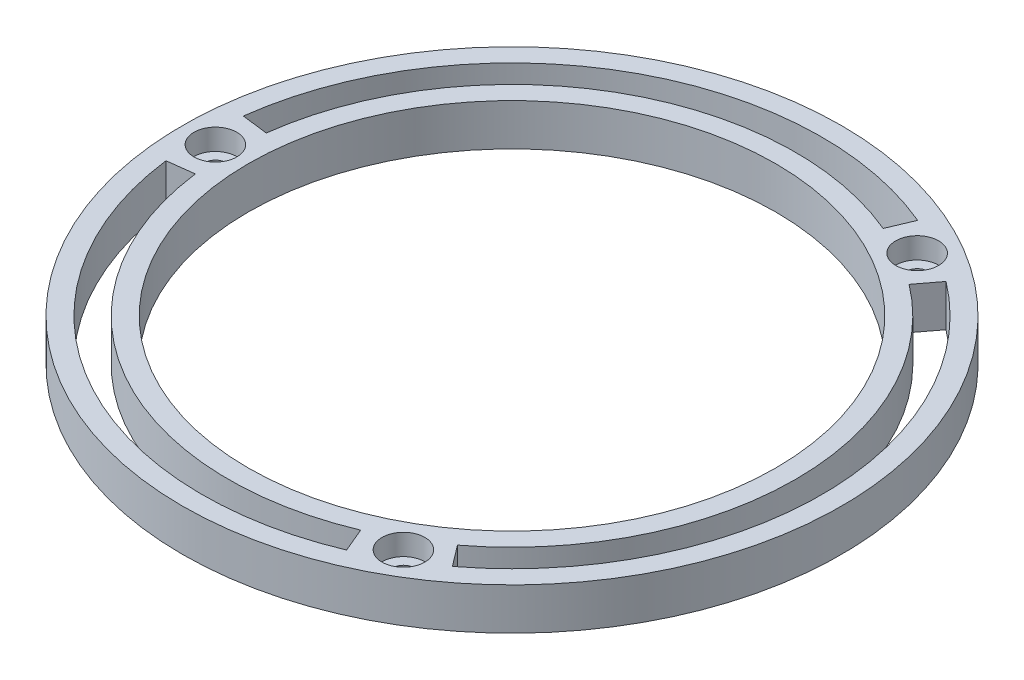
ISO-10303-21;
HEADER;
FILE_DESCRIPTION(('STEP AP214'),'2;1');
FILE_NAME('part.step','',(''),(''),'','','');
FILE_SCHEMA(('AUTOMOTIVE_DESIGN { 1 0 10303 214 1 1 1 1 }'));
ENDSEC;
DATA;
#1=APPLICATION_CONTEXT('core data for automotive mechanical design processes');
#2=APPLICATION_PROTOCOL_DEFINITION('international standard','automotive_design',2000,#1);
#3=PRODUCT_CONTEXT('',#1,'mechanical');
#4=PRODUCT('Part','Part','',(#3));
#5=PRODUCT_RELATED_PRODUCT_CATEGORY('part','',(#4));
#6=PRODUCT_DEFINITION_FORMATION('','',#4);
#7=PRODUCT_DEFINITION_CONTEXT('part definition',#1,'design');
#8=PRODUCT_DEFINITION('design','',#6,#7);
#9=PRODUCT_DEFINITION_SHAPE('','',#8);
#10=(LENGTH_UNIT() NAMED_UNIT(*) SI_UNIT(.MILLI.,.METRE.));
#11=(NAMED_UNIT(*) PLANE_ANGLE_UNIT() SI_UNIT($,.RADIAN.));
#12=(NAMED_UNIT(*) SI_UNIT($,.STERADIAN.) SOLID_ANGLE_UNIT());
#13=UNCERTAINTY_MEASURE_WITH_UNIT(LENGTH_MEASURE(1.E-05),#10,'distance_accuracy_value','');
#14=(GEOMETRIC_REPRESENTATION_CONTEXT(3) GLOBAL_UNCERTAINTY_ASSIGNED_CONTEXT((#13)) GLOBAL_UNIT_ASSIGNED_CONTEXT((#10,
#11,#12)) REPRESENTATION_CONTEXT('',''));
#15=CARTESIAN_POINT('',(0.,0.,0.));
#16=DIRECTION('',(0.,0.,1.));
#17=DIRECTION('',(1.,0.,0.));
#18=AXIS2_PLACEMENT_3D('',#15,#16,#17);
#19=CARTESIAN_POINT('',(22.5,-0.00100000000000013,-38.9711431702997));
#20=DIRECTION('',(0.,1.,0.));
#21=DIRECTION('',(0.,0.,1.));
#22=AXIS2_PLACEMENT_3D('',#19,#20,#21);
#23=CYLINDRICAL_SURFACE('',#22,1.65);
#24=CARTESIAN_POINT('',(22.5,0.,-38.9711431702997));
#25=DIRECTION('',(0.,1.,0.));
#26=DIRECTION('',(0.,0.,1.));
#27=AXIS2_PLACEMENT_3D('',#24,#25,#26);
#28=CIRCLE('',#27,1.65);
#29=CARTESIAN_POINT('',(22.5,0.,-37.3211431702997));
#30=VERTEX_POINT('',#29);
#31=EDGE_CURVE('E235',#30,#30,#28,.F.);
#32=ORIENTED_EDGE('',*,*,#31,.T.);
#33=EDGE_LOOP('',(#32));
#34=FACE_BOUND('',#33,.T.);
#35=CARTESIAN_POINT('',(22.5,3.15,-38.9711431702997));
#36=DIRECTION('',(0.,1.,0.));
#37=DIRECTION('',(0.,0.,1.));
#38=AXIS2_PLACEMENT_3D('',#35,#36,#37);
#39=CIRCLE('',#38,1.65);
#40=CARTESIAN_POINT('',(22.5,3.15,-37.3211431702997));
#41=VERTEX_POINT('',#40);
#42=EDGE_CURVE('E49',#41,#41,#39,.F.);
#43=ORIENTED_EDGE('',*,*,#42,.F.);
#44=EDGE_LOOP('',(#43));
#45=FACE_BOUND('',#44,.T.);
#46=ADVANCED_FACE('F45',(#34,#45),#23,.F.);
#47=CARTESIAN_POINT('',(22.5,-0.00100000000000013,38.9711431702997));
#48=DIRECTION('',(0.,1.,0.));
#49=DIRECTION('',(0.,0.,1.));
#50=AXIS2_PLACEMENT_3D('',#47,#48,#49);
#51=CYLINDRICAL_SURFACE('',#50,1.65);
#52=CARTESIAN_POINT('',(22.5,0.,38.9711431702997));
#53=DIRECTION('',(0.,1.,0.));
#54=DIRECTION('',(0.,0.,1.));
#55=AXIS2_PLACEMENT_3D('',#52,#53,#54);
#56=CIRCLE('',#55,1.65);
#57=CARTESIAN_POINT('',(22.5,0.,40.6211431702997));
#58=VERTEX_POINT('',#57);
#59=EDGE_CURVE('E239',#58,#58,#56,.F.);
#60=ORIENTED_EDGE('',*,*,#59,.T.);
#61=EDGE_LOOP('',(#60));
#62=FACE_BOUND('',#61,.T.);
#63=CARTESIAN_POINT('',(22.5,3.15,38.9711431702997));
#64=DIRECTION('',(0.,1.,0.));
#65=DIRECTION('',(0.,0.,1.));
#66=AXIS2_PLACEMENT_3D('',#63,#64,#65);
#67=CIRCLE('',#66,1.65);
#68=CARTESIAN_POINT('',(22.5,3.15,40.6211431702997));
#69=VERTEX_POINT('',#68);
#70=EDGE_CURVE('E229',#69,#69,#67,.F.);
#71=ORIENTED_EDGE('',*,*,#70,.F.);
#72=EDGE_LOOP('',(#71));
#73=FACE_BOUND('',#72,.T.);
#74=ADVANCED_FACE('F311',(#62,#73),#51,.F.);
#75=CARTESIAN_POINT('',(-45.,-0.00100000000000013,0.));
#76=DIRECTION('',(0.,1.,0.));
#77=DIRECTION('',(0.,0.,1.));
#78=AXIS2_PLACEMENT_3D('',#75,#76,#77);
#79=CYLINDRICAL_SURFACE('',#78,1.65);
#80=CARTESIAN_POINT('',(-45.,0.,0.));
#81=DIRECTION('',(0.,1.,0.));
#82=DIRECTION('',(0.,0.,1.));
#83=AXIS2_PLACEMENT_3D('',#80,#81,#82);
#84=CIRCLE('',#83,1.65);
#85=CARTESIAN_POINT('',(-45.,0.,1.65));
#86=VERTEX_POINT('',#85);
#87=EDGE_CURVE('E174',#86,#86,#84,.F.);
#88=ORIENTED_EDGE('',*,*,#87,.T.);
#89=EDGE_LOOP('',(#88));
#90=FACE_BOUND('',#89,.T.);
#91=CARTESIAN_POINT('',(-45.,3.15,0.));
#92=DIRECTION('',(0.,1.,0.));
#93=DIRECTION('',(0.,0.,1.));
#94=AXIS2_PLACEMENT_3D('',#91,#92,#93);
#95=CIRCLE('',#94,1.65);
#96=CARTESIAN_POINT('',(-45.,3.15,1.65));
#97=VERTEX_POINT('',#96);
#98=EDGE_CURVE('E227',#97,#97,#95,.F.);
#99=ORIENTED_EDGE('',*,*,#98,.F.);
#100=EDGE_LOOP('',(#99));
#101=FACE_BOUND('',#100,.T.);
#102=ADVANCED_FACE('F316',(#90,#101),#79,.F.);
#103=CARTESIAN_POINT('',(0.,6.35,0.));
#104=DIRECTION('',(-0.796732942804221,0.,0.604331546297664));
#105=DIRECTION('',(0.604331546297664,0.,0.796732942804221));
#106=AXIS2_PLACEMENT_3D('',#103,#104,#105);
#107=PLANE('',#106);
#108=DIRECTION('',(-0.604331546297664,0.,-0.796732942804221));
#109=VECTOR('',#108,1.);
#110=CARTESIAN_POINT('',(0.,0.,0.));
#111=LINE('',#110,#109);
#112=CARTESIAN_POINT('',(28.4035826759902,0.,37.4464483117984));
#113=VERTEX_POINT('',#112);
#114=CARTESIAN_POINT('',(25.9862564907996,0.,34.2595165405815));
#115=VERTEX_POINT('',#114);
#116=EDGE_CURVE('E197',#113,#115,#111,.T.);
#117=ORIENTED_EDGE('',*,*,#116,.T.);
#118=DIRECTION('',(0.,-1.,0.));
#119=VECTOR('',#118,1.);
#120=CARTESIAN_POINT('',(25.9862564907996,6.35,34.2595165405815));
#121=LINE('',#120,#119);
#122=CARTESIAN_POINT('',(25.9862564907996,6.35,34.2595165405815));
#123=VERTEX_POINT('',#122);
#124=EDGE_CURVE('E11',#123,#115,#121,.T.);
#125=ORIENTED_EDGE('',*,*,#124,.F.);
#126=DIRECTION('',(-0.604331546297664,0.,-0.796732942804221));
#127=VECTOR('',#126,1.);
#128=CARTESIAN_POINT('',(0.,6.35,0.));
#129=LINE('',#128,#127);
#130=CARTESIAN_POINT('',(28.4035826759902,6.35,37.4464483117984));
#131=VERTEX_POINT('',#130);
#132=EDGE_CURVE('E150',#131,#123,#129,.T.);
#133=ORIENTED_EDGE('',*,*,#132,.F.);
#134=DIRECTION('',(0.,-1.,0.));
#135=VECTOR('',#134,1.);
#136=CARTESIAN_POINT('',(28.4035826759902,6.35,37.4464483117984));
#137=LINE('',#136,#135);
#138=EDGE_CURVE('E64',#131,#113,#137,.T.);
#139=ORIENTED_EDGE('',*,*,#138,.T.);
#140=EDGE_LOOP('',(#117,#125,#133,#139));
#141=FACE_BOUND('',#140,.T.);
#142=ADVANCED_FACE('F323',(#141),#107,.F.);
#143=CARTESIAN_POINT('',(0.,6.35,0.));
#144=DIRECTION('',(0.,-1.,0.));
#145=DIRECTION('',(0.,0.,-1.));
#146=AXIS2_PLACEMENT_3D('',#143,#144,#145);
#147=CYLINDRICAL_SURFACE('',#146,43.);
#148=CARTESIAN_POINT('',(0.,0.,0.));
#149=DIRECTION('',(0.,1.,0.));
#150=DIRECTION('',(0.,0.,1.));
#151=AXIS2_PLACEMENT_3D('',#148,#149,#150);
#152=CIRCLE('',#151,43.);
#153=CARTESIAN_POINT('',(25.9862564907995,0.,-34.2595165405815));
#154=VERTEX_POINT('',#153);
#155=EDGE_CURVE('E156',#115,#154,#152,.T.);
#156=ORIENTED_EDGE('',*,*,#155,.T.);
#157=DIRECTION('',(0.,-1.,0.));
#158=VECTOR('',#157,1.);
#159=CARTESIAN_POINT('',(25.9862564907995,6.35,-34.2595165405815));
#160=LINE('',#159,#158);
#161=CARTESIAN_POINT('',(25.9862564907995,6.35,-34.2595165405815));
#162=VERTEX_POINT('',#161);
#163=EDGE_CURVE('E55',#162,#154,#160,.T.);
#164=ORIENTED_EDGE('',*,*,#163,.F.);
#165=CARTESIAN_POINT('',(0.,6.35,0.));
#166=DIRECTION('',(0.,1.,0.));
#167=DIRECTION('',(0.,0.,1.));
#168=AXIS2_PLACEMENT_3D('',#165,#166,#167);
#169=CIRCLE('',#168,43.);
#170=EDGE_CURVE('E143',#123,#162,#169,.T.);
#171=ORIENTED_EDGE('',*,*,#170,.F.);
#172=ORIENTED_EDGE('',*,*,#124,.T.);
#173=EDGE_LOOP('',(#156,#164,#171,#172));
#174=FACE_BOUND('',#173,.T.);
#175=ADVANCED_FACE('F155',(#174),#147,.T.);
#176=CARTESIAN_POINT('',(0.,6.35,0.));
#177=DIRECTION('',(0.796732942804222,0.,0.604331546297663));
#178=DIRECTION('',(0.604331546297663,0.,-0.796732942804222));
#179=AXIS2_PLACEMENT_3D('',#176,#177,#178);
#180=PLANE('',#179);
#181=DIRECTION('',(-0.604331546297663,0.,0.796732942804222));
#182=VECTOR('',#181,1.);
#183=CARTESIAN_POINT('',(0.,0.,0.));
#184=LINE('',#183,#182);
#185=CARTESIAN_POINT('',(28.4035826759902,0.,-37.4464483117984));
#186=VERTEX_POINT('',#185);
#187=EDGE_CURVE('E200',#186,#154,#184,.T.);
#188=ORIENTED_EDGE('',*,*,#187,.F.);
#189=DIRECTION('',(0.,-1.,0.));
#190=VECTOR('',#189,1.);
#191=CARTESIAN_POINT('',(28.4035826759902,6.35,-37.4464483117984));
#192=LINE('',#191,#190);
#193=CARTESIAN_POINT('',(28.4035826759902,6.35,-37.4464483117984));
#194=VERTEX_POINT('',#193);
#195=EDGE_CURVE('E102',#194,#186,#192,.T.);
#196=ORIENTED_EDGE('',*,*,#195,.F.);
#197=DIRECTION('',(-0.604331546297663,0.,0.796732942804222));
#198=VECTOR('',#197,1.);
#199=CARTESIAN_POINT('',(0.,6.35,0.));
#200=LINE('',#199,#198);
#201=EDGE_CURVE('E149',#194,#162,#200,.T.);
#202=ORIENTED_EDGE('',*,*,#201,.T.);
#203=ORIENTED_EDGE('',*,*,#163,.T.);
#204=EDGE_LOOP('',(#188,#196,#202,#203));
#205=FACE_BOUND('',#204,.T.);
#206=ADVANCED_FACE('F160',(#205),#180,.T.);
#207=CARTESIAN_POINT('',(0.,6.35,0.));
#208=DIRECTION('',(0.,-1.,0.));
#209=DIRECTION('',(0.,0.,-1.));
#210=AXIS2_PLACEMENT_3D('',#207,#208,#209);
#211=CYLINDRICAL_SURFACE('',#210,43.);
#212=CARTESIAN_POINT('',(0.,0.,0.));
#213=DIRECTION('',(0.,1.,0.));
#214=DIRECTION('',(0.,0.,1.));
#215=AXIS2_PLACEMENT_3D('',#212,#213,#214);
#216=CIRCLE('',#215,43.);
#217=CARTESIAN_POINT('',(16.6764834001168,0.,-39.6345165405815));
#218=VERTEX_POINT('',#217);
#219=CARTESIAN_POINT('',(-42.6627398909165,0.,-5.375));
#220=VERTEX_POINT('',#219);
#221=EDGE_CURVE('E186',#218,#220,#216,.T.);
#222=ORIENTED_EDGE('',*,*,#221,.T.);
#223=DIRECTION('',(0.,-1.,0.));
#224=VECTOR('',#223,1.);
#225=CARTESIAN_POINT('',(-42.6627398909165,6.35,-5.375));
#226=LINE('',#225,#224);
#227=CARTESIAN_POINT('',(-42.6627398909165,6.35,-5.375));
#228=VERTEX_POINT('',#227);
#229=EDGE_CURVE('E210',#228,#220,#226,.T.);
#230=ORIENTED_EDGE('',*,*,#229,.F.);
#231=CARTESIAN_POINT('',(0.,6.35,0.));
#232=DIRECTION('',(0.,1.,0.));
#233=DIRECTION('',(0.,0.,1.));
#234=AXIS2_PLACEMENT_3D('',#231,#232,#233);
#235=CIRCLE('',#234,43.);
#236=CARTESIAN_POINT('',(16.6764834001168,6.35,-39.6345165405815));
#237=VERTEX_POINT('',#236);
#238=EDGE_CURVE('E258',#237,#228,#235,.T.);
#239=ORIENTED_EDGE('',*,*,#238,.F.);
#240=DIRECTION('',(0.,-1.,0.));
#241=VECTOR('',#240,1.);
#242=CARTESIAN_POINT('',(16.6764834001168,6.35,-39.6345165405815));
#243=LINE('',#242,#241);
#244=EDGE_CURVE('E212',#237,#218,#243,.T.);
#245=ORIENTED_EDGE('',*,*,#244,.T.);
#246=EDGE_LOOP('',(#222,#230,#239,#245));
#247=FACE_BOUND('',#246,.T.);
#248=ADVANCED_FACE('F279',(#247),#211,.T.);
#249=CARTESIAN_POINT('',(0.,6.35,0.));
#250=DIRECTION('',(0.125,0.,-0.992156741649221));
#251=DIRECTION('',(-0.992156741649222,0.,-0.125));
#252=AXIS2_PLACEMENT_3D('',#249,#250,#251);
#253=PLANE('',#252);
#254=DIRECTION('',(0.992156741649222,0.,0.125));
#255=VECTOR('',#254,1.);
#256=CARTESIAN_POINT('',(0.,0.,0.));
#257=LINE('',#256,#255);
#258=CARTESIAN_POINT('',(-46.6313668575134,0.,-5.875));
#259=VERTEX_POINT('',#258);
#260=EDGE_CURVE('E189',#259,#220,#257,.T.);
#261=ORIENTED_EDGE('',*,*,#260,.F.);
#262=DIRECTION('',(0.,-1.,0.));
#263=VECTOR('',#262,1.);
#264=CARTESIAN_POINT('',(-46.6313668575134,6.35,-5.875));
#265=LINE('',#264,#263);
#266=CARTESIAN_POINT('',(-46.6313668575134,6.35,-5.875));
#267=VERTEX_POINT('',#266);
#268=EDGE_CURVE('E218',#267,#259,#265,.T.);
#269=ORIENTED_EDGE('',*,*,#268,.F.);
#270=DIRECTION('',(0.992156741649222,0.,0.125));
#271=VECTOR('',#270,1.);
#272=CARTESIAN_POINT('',(0.,6.35,0.));
#273=LINE('',#272,#271);
#274=EDGE_CURVE('E260',#267,#228,#273,.T.);
#275=ORIENTED_EDGE('',*,*,#274,.T.);
#276=ORIENTED_EDGE('',*,*,#229,.T.);
#277=EDGE_LOOP('',(#261,#269,#275,#276));
#278=FACE_BOUND('',#277,.T.);
#279=ADVANCED_FACE('F282',(#278),#253,.T.);
#280=CARTESIAN_POINT('',(0.,6.35,0.));
#281=DIRECTION('',(0.,-1.,0.));
#282=DIRECTION('',(0.,0.,-1.));
#283=AXIS2_PLACEMENT_3D('',#280,#281,#282);
#284=CYLINDRICAL_SURFACE('',#283,47.);
#285=CARTESIAN_POINT('',(0.,0.,0.));
#286=DIRECTION('',(0.,1.,0.));
#287=DIRECTION('',(0.,0.,1.));
#288=AXIS2_PLACEMENT_3D('',#285,#286,#287);
#289=CIRCLE('',#288,47.);
#290=CARTESIAN_POINT('',(18.227784181523,0.,-43.3214483117984));
#291=VERTEX_POINT('',#290);
#292=EDGE_CURVE('E192',#291,#259,#289,.T.);
#293=ORIENTED_EDGE('',*,*,#292,.F.);
#294=DIRECTION('',(0.,-1.,0.));
#295=VECTOR('',#294,1.);
#296=CARTESIAN_POINT('',(18.227784181523,6.35,-43.3214483117984));
#297=LINE('',#296,#295);
#298=CARTESIAN_POINT('',(18.227784181523,6.35,-43.3214483117984));
#299=VERTEX_POINT('',#298);
#300=EDGE_CURVE('E215',#299,#291,#297,.T.);
#301=ORIENTED_EDGE('',*,*,#300,.F.);
#302=CARTESIAN_POINT('',(0.,6.35,0.));
#303=DIRECTION('',(0.,1.,0.));
#304=DIRECTION('',(0.,0.,1.));
#305=AXIS2_PLACEMENT_3D('',#302,#303,#304);
#306=CIRCLE('',#305,47.);
#307=EDGE_CURVE('E263',#299,#267,#306,.T.);
#308=ORIENTED_EDGE('',*,*,#307,.T.);
#309=ORIENTED_EDGE('',*,*,#268,.T.);
#310=EDGE_LOOP('',(#293,#301,#308,#309));
#311=FACE_BOUND('',#310,.T.);
#312=ADVANCED_FACE('F285',(#311),#284,.F.);
#313=CARTESIAN_POINT('',(0.,6.35,0.));
#314=DIRECTION('',(-0.125,0.,-0.992156741649221));
#315=DIRECTION('',(-0.992156741649222,0.,0.125));
#316=AXIS2_PLACEMENT_3D('',#313,#314,#315);
#317=PLANE('',#316);
#318=DIRECTION('',(0.992156741649222,0.,-0.125));
#319=VECTOR('',#318,1.);
#320=CARTESIAN_POINT('',(0.,0.,0.));
#321=LINE('',#320,#319);
#322=CARTESIAN_POINT('',(-46.6313668575134,0.,5.875));
#323=VERTEX_POINT('',#322);
#324=CARTESIAN_POINT('',(-42.6627398909165,0.,5.375));
#325=VERTEX_POINT('',#324);
#326=EDGE_CURVE('E173',#323,#325,#321,.T.);
#327=ORIENTED_EDGE('',*,*,#326,.T.);
#328=DIRECTION('',(0.,-1.,0.));
#329=VECTOR('',#328,1.);
#330=CARTESIAN_POINT('',(-42.6627398909165,6.35,5.375));
#331=LINE('',#330,#329);
#332=CARTESIAN_POINT('',(-42.6627398909165,6.35,5.375));
#333=VERTEX_POINT('',#332);
#334=EDGE_CURVE('E216',#333,#325,#331,.T.);
#335=ORIENTED_EDGE('',*,*,#334,.F.);
#336=DIRECTION('',(0.992156741649222,0.,-0.125));
#337=VECTOR('',#336,1.);
#338=CARTESIAN_POINT('',(0.,6.35,0.));
#339=LINE('',#338,#337);
#340=CARTESIAN_POINT('',(-46.6313668575134,6.35,5.875));
#341=VERTEX_POINT('',#340);
#342=EDGE_CURVE('E249',#341,#333,#339,.T.);
#343=ORIENTED_EDGE('',*,*,#342,.F.);
#344=DIRECTION('',(0.,-1.,0.));
#345=VECTOR('',#344,1.);
#346=CARTESIAN_POINT('',(-46.6313668575134,6.35,5.875));
#347=LINE('',#346,#345);
#348=EDGE_CURVE('E169',#341,#323,#347,.T.);
#349=ORIENTED_EDGE('',*,*,#348,.T.);
#350=EDGE_LOOP('',(#327,#335,#343,#349));
#351=FACE_BOUND('',#350,.T.);
#352=ADVANCED_FACE('F390',(#351),#317,.F.);
#353=CARTESIAN_POINT('',(0.,6.35,0.));
#354=DIRECTION('',(0.,-1.,0.));
#355=DIRECTION('',(0.,0.,-1.));
#356=AXIS2_PLACEMENT_3D('',#353,#354,#355);
#357=CYLINDRICAL_SURFACE('',#356,43.);
#358=CARTESIAN_POINT('',(0.,0.,0.));
#359=DIRECTION('',(0.,1.,0.));
#360=DIRECTION('',(0.,0.,1.));
#361=AXIS2_PLACEMENT_3D('',#358,#359,#360);
#362=CIRCLE('',#361,43.);
#363=CARTESIAN_POINT('',(16.6764834001168,0.,39.6345165405815));
#364=VERTEX_POINT('',#363);
#365=EDGE_CURVE('E177',#325,#364,#362,.T.);
#366=ORIENTED_EDGE('',*,*,#365,.T.);
#367=DIRECTION('',(0.,-1.,0.));
#368=VECTOR('',#367,1.);
#369=CARTESIAN_POINT('',(16.6764834001168,6.35,39.6345165405815));
#370=LINE('',#369,#368);
#371=CARTESIAN_POINT('',(16.6764834001168,6.35,39.6345165405815));
#372=VERTEX_POINT('',#371);
#373=EDGE_CURVE('E224',#372,#364,#370,.T.);
#374=ORIENTED_EDGE('',*,*,#373,.F.);
#375=CARTESIAN_POINT('',(0.,6.35,0.));
#376=DIRECTION('',(0.,1.,0.));
#377=DIRECTION('',(0.,0.,1.));
#378=AXIS2_PLACEMENT_3D('',#375,#376,#377);
#379=CIRCLE('',#378,43.);
#380=EDGE_CURVE('E115',#333,#372,#379,.T.);
#381=ORIENTED_EDGE('',*,*,#380,.F.);
#382=ORIENTED_EDGE('',*,*,#334,.T.);
#383=EDGE_LOOP('',(#366,#374,#381,#382));
#384=FACE_BOUND('',#383,.T.);
#385=ADVANCED_FACE('F389',(#384),#357,.T.);
#386=CARTESIAN_POINT('',(0.,6.35,0.));
#387=DIRECTION('',(-0.921732942804221,0.,0.387825195351554));
#388=DIRECTION('',(0.387825195351554,0.,0.921732942804221));
#389=AXIS2_PLACEMENT_3D('',#386,#387,#388);
#390=PLANE('',#389);
#391=DIRECTION('',(-0.387825195351554,0.,-0.921732942804221));
#392=VECTOR('',#391,1.);
#393=CARTESIAN_POINT('',(0.,0.,0.));
#394=LINE('',#393,#392);
#395=CARTESIAN_POINT('',(18.227784181523,0.,43.3214483117984));
#396=VERTEX_POINT('',#395);
#397=EDGE_CURVE('E180',#396,#364,#394,.T.);
#398=ORIENTED_EDGE('',*,*,#397,.F.);
#399=DIRECTION('',(0.,-1.,0.));
#400=VECTOR('',#399,1.);
#401=CARTESIAN_POINT('',(18.227784181523,6.35,43.3214483117984));
#402=LINE('',#401,#400);
#403=CARTESIAN_POINT('',(18.227784181523,6.35,43.3214483117984));
#404=VERTEX_POINT('',#403);
#405=EDGE_CURVE('E222',#404,#396,#402,.T.);
#406=ORIENTED_EDGE('',*,*,#405,.F.);
#407=DIRECTION('',(-0.387825195351554,0.,-0.921732942804221));
#408=VECTOR('',#407,1.);
#409=CARTESIAN_POINT('',(0.,6.35,0.));
#410=LINE('',#409,#408);
#411=EDGE_CURVE('E252',#404,#372,#410,.T.);
#412=ORIENTED_EDGE('',*,*,#411,.T.);
#413=ORIENTED_EDGE('',*,*,#373,.T.);
#414=EDGE_LOOP('',(#398,#406,#412,#413));
#415=FACE_BOUND('',#414,.T.);
#416=ADVANCED_FACE('F388',(#415),#390,.T.);
#417=CARTESIAN_POINT('',(0.,6.35,0.));
#418=DIRECTION('',(0.,-1.,0.));
#419=DIRECTION('',(0.,0.,-1.));
#420=AXIS2_PLACEMENT_3D('',#417,#418,#419);
#421=CYLINDRICAL_SURFACE('',#420,47.);
#422=CARTESIAN_POINT('',(0.,0.,0.));
#423=DIRECTION('',(0.,1.,0.));
#424=DIRECTION('',(0.,0.,1.));
#425=AXIS2_PLACEMENT_3D('',#422,#423,#424);
#426=CIRCLE('',#425,47.);
#427=EDGE_CURVE('E202',#113,#186,#426,.T.);
#428=ORIENTED_EDGE('',*,*,#427,.F.);
#429=ORIENTED_EDGE('',*,*,#138,.F.);
#430=CARTESIAN_POINT('',(0.,6.35,0.));
#431=DIRECTION('',(0.,1.,0.));
#432=DIRECTION('',(0.,0.,1.));
#433=AXIS2_PLACEMENT_3D('',#430,#431,#432);
#434=CIRCLE('',#433,47.);
#435=EDGE_CURVE('E161',#131,#194,#434,.T.);
#436=ORIENTED_EDGE('',*,*,#435,.T.);
#437=ORIENTED_EDGE('',*,*,#195,.T.);
#438=EDGE_LOOP('',(#428,#429,#436,#437));
#439=FACE_BOUND('',#438,.T.);
#440=ADVANCED_FACE('F402',(#439),#421,.F.);
#441=CARTESIAN_POINT('',(0.,6.35,0.));
#442=DIRECTION('',(0.921732942804221,0.,0.387825195351553));
#443=DIRECTION('',(0.387825195351553,0.,-0.921732942804221));
#444=AXIS2_PLACEMENT_3D('',#441,#442,#443);
#445=PLANE('',#444);
#446=DIRECTION('',(-0.387825195351553,0.,0.921732942804221));
#447=VECTOR('',#446,1.);
#448=CARTESIAN_POINT('',(0.,0.,0.));
#449=LINE('',#448,#447);
#450=EDGE_CURVE('E195',#291,#218,#449,.T.);
#451=ORIENTED_EDGE('',*,*,#450,.T.);
#452=ORIENTED_EDGE('',*,*,#244,.F.);
#453=DIRECTION('',(-0.387825195351553,0.,0.921732942804221));
#454=VECTOR('',#453,1.);
#455=CARTESIAN_POINT('',(0.,6.35,0.));
#456=LINE('',#455,#454);
#457=EDGE_CURVE('E266',#299,#237,#456,.T.);
#458=ORIENTED_EDGE('',*,*,#457,.F.);
#459=ORIENTED_EDGE('',*,*,#300,.T.);
#460=EDGE_LOOP('',(#451,#452,#458,#459));
#461=FACE_BOUND('',#460,.T.);
#462=ADVANCED_FACE('F275',(#461),#445,.F.);
#463=CARTESIAN_POINT('',(0.,6.35,0.));
#464=DIRECTION('',(0.,-1.,0.));
#465=DIRECTION('',(0.,0.,-1.));
#466=AXIS2_PLACEMENT_3D('',#463,#464,#465);
#467=CYLINDRICAL_SURFACE('',#466,47.);
#468=CARTESIAN_POINT('',(0.,0.,0.));
#469=DIRECTION('',(0.,1.,0.));
#470=DIRECTION('',(0.,0.,1.));
#471=AXIS2_PLACEMENT_3D('',#468,#469,#470);
#472=CIRCLE('',#471,47.);
#473=EDGE_CURVE('E183',#323,#396,#472,.T.);
#474=ORIENTED_EDGE('',*,*,#473,.F.);
#475=ORIENTED_EDGE('',*,*,#348,.F.);
#476=CARTESIAN_POINT('',(0.,6.35,0.));
#477=DIRECTION('',(0.,1.,0.));
#478=DIRECTION('',(0.,0.,1.));
#479=AXIS2_PLACEMENT_3D('',#476,#477,#478);
#480=CIRCLE('',#479,47.);
#481=EDGE_CURVE('E255',#341,#404,#480,.T.);
#482=ORIENTED_EDGE('',*,*,#481,.T.);
#483=ORIENTED_EDGE('',*,*,#405,.T.);
#484=EDGE_LOOP('',(#474,#475,#482,#483));
#485=FACE_BOUND('',#484,.T.);
#486=ADVANCED_FACE('F306',(#485),#467,.F.);
#487=CARTESIAN_POINT('',(0.,6.35,0.));
#488=DIRECTION('',(0.,-1.,0.));
#489=DIRECTION('',(0.,0.,-1.));
#490=AXIS2_PLACEMENT_3D('',#487,#488,#489);
#491=CYLINDRICAL_SURFACE('',#490,40.);
#492=CARTESIAN_POINT('',(0.,6.35,0.));
#493=DIRECTION('',(0.,1.,0.));
#494=DIRECTION('',(0.,0.,1.));
#495=AXIS2_PLACEMENT_3D('',#492,#493,#494);
#496=CIRCLE('',#495,40.);
#497=CARTESIAN_POINT('',(0.,6.35,40.));
#498=VERTEX_POINT('',#497);
#499=EDGE_CURVE('E208',#498,#498,#496,.T.);
#500=ORIENTED_EDGE('',*,*,#499,.T.);
#501=EDGE_LOOP('',(#500));
#502=FACE_BOUND('',#501,.T.);
#503=CARTESIAN_POINT('',(0.,0.,0.));
#504=DIRECTION('',(0.,1.,0.));
#505=DIRECTION('',(0.,0.,1.));
#506=AXIS2_PLACEMENT_3D('',#503,#504,#505);
#507=CIRCLE('',#506,40.);
#508=CARTESIAN_POINT('',(0.,0.,40.));
#509=VERTEX_POINT('',#508);
#510=EDGE_CURVE('E170',#509,#509,#507,.T.);
#511=ORIENTED_EDGE('',*,*,#510,.F.);
#512=EDGE_LOOP('',(#511));
#513=FACE_BOUND('',#512,.T.);
#514=ADVANCED_FACE('F47',(#502,#513),#491,.F.);
#515=CARTESIAN_POINT('',(0.,6.35,0.));
#516=DIRECTION('',(0.,-1.,0.));
#517=DIRECTION('',(0.,0.,-1.));
#518=AXIS2_PLACEMENT_3D('',#515,#516,#517);
#519=CYLINDRICAL_SURFACE('',#518,50.);
#520=CARTESIAN_POINT('',(0.,6.35,0.));
#521=DIRECTION('',(0.,1.,0.));
#522=DIRECTION('',(0.,0.,1.));
#523=AXIS2_PLACEMENT_3D('',#520,#521,#522);
#524=CIRCLE('',#523,50.);
#525=CARTESIAN_POINT('',(0.,6.35,50.));
#526=VERTEX_POINT('',#525);
#527=EDGE_CURVE('E163',#526,#526,#524,.T.);
#528=ORIENTED_EDGE('',*,*,#527,.F.);
#529=EDGE_LOOP('',(#528));
#530=FACE_BOUND('',#529,.T.);
#531=CARTESIAN_POINT('',(0.,0.,0.));
#532=DIRECTION('',(0.,1.,0.));
#533=DIRECTION('',(0.,0.,1.));
#534=AXIS2_PLACEMENT_3D('',#531,#532,#533);
#535=CIRCLE('',#534,50.);
#536=CARTESIAN_POINT('',(0.,0.,50.));
#537=VERTEX_POINT('',#536);
#538=EDGE_CURVE('E205',#537,#537,#535,.T.);
#539=ORIENTED_EDGE('',*,*,#538,.T.);
#540=EDGE_LOOP('',(#539));
#541=FACE_BOUND('',#540,.T.);
#542=ADVANCED_FACE('F296',(#530,#541),#519,.T.);
#543=CARTESIAN_POINT('',(0.,6.35,0.));
#544=DIRECTION('',(0.,1.,0.));
#545=DIRECTION('',(0.,0.,1.));
#546=AXIS2_PLACEMENT_3D('',#543,#544,#545);
#547=PLANE('',#546);
#548=CARTESIAN_POINT('',(-45.,6.35,0.));
#549=DIRECTION('',(0.,1.,0.));
#550=DIRECTION('',(0.,0.,1.));
#551=AXIS2_PLACEMENT_3D('',#548,#549,#550);
#552=CIRCLE('',#551,3.25);
#553=CARTESIAN_POINT('',(-45.,6.35,3.25));
#554=VERTEX_POINT('',#553);
#555=EDGE_CURVE('E354',#554,#554,#552,.T.);
#556=ORIENTED_EDGE('',*,*,#555,.F.);
#557=EDGE_LOOP('',(#556));
#558=FACE_BOUND('',#557,.T.);
#559=CARTESIAN_POINT('',(22.5,6.35,-38.9711431702997));
#560=DIRECTION('',(0.,1.,0.));
#561=DIRECTION('',(0.,0.,1.));
#562=AXIS2_PLACEMENT_3D('',#559,#560,#561);
#563=CIRCLE('',#562,3.25);
#564=CARTESIAN_POINT('',(22.5,6.35,-35.7211431702997));
#565=VERTEX_POINT('',#564);
#566=EDGE_CURVE('E357',#565,#565,#563,.T.);
#567=ORIENTED_EDGE('',*,*,#566,.F.);
#568=EDGE_LOOP('',(#567));
#569=FACE_BOUND('',#568,.T.);
#570=CARTESIAN_POINT('',(22.5,6.35,38.9711431702997));
#571=DIRECTION('',(0.,1.,0.));
#572=DIRECTION('',(0.,0.,1.));
#573=AXIS2_PLACEMENT_3D('',#570,#571,#572);
#574=CIRCLE('',#573,3.25);
#575=CARTESIAN_POINT('',(22.5,6.35,42.2211431702997));
#576=VERTEX_POINT('',#575);
#577=EDGE_CURVE('E365',#576,#576,#574,.T.);
#578=ORIENTED_EDGE('',*,*,#577,.F.);
#579=EDGE_LOOP('',(#578));
#580=FACE_BOUND('',#579,.T.);
#581=ORIENTED_EDGE('',*,*,#499,.F.);
#582=EDGE_LOOP('',(#581));
#583=FACE_BOUND('',#582,.T.);
#584=ORIENTED_EDGE('',*,*,#342,.T.);
#585=ORIENTED_EDGE('',*,*,#380,.T.);
#586=ORIENTED_EDGE('',*,*,#411,.F.);
#587=ORIENTED_EDGE('',*,*,#481,.F.);
#588=EDGE_LOOP('',(#584,#585,#586,#587));
#589=FACE_BOUND('',#588,.T.);
#590=ORIENTED_EDGE('',*,*,#238,.T.);
#591=ORIENTED_EDGE('',*,*,#274,.F.);
#592=ORIENTED_EDGE('',*,*,#307,.F.);
#593=ORIENTED_EDGE('',*,*,#457,.T.);
#594=EDGE_LOOP('',(#590,#591,#592,#593));
#595=FACE_BOUND('',#594,.T.);
#596=ORIENTED_EDGE('',*,*,#132,.T.);
#597=ORIENTED_EDGE('',*,*,#170,.T.);
#598=ORIENTED_EDGE('',*,*,#201,.F.);
#599=ORIENTED_EDGE('',*,*,#435,.F.);
#600=EDGE_LOOP('',(#596,#597,#598,#599));
#601=FACE_BOUND('',#600,.T.);
#602=ORIENTED_EDGE('',*,*,#527,.T.);
#603=EDGE_LOOP('',(#602));
#604=FACE_BOUND('',#603,.T.);
#605=ADVANCED_FACE('F145',(#558,#569,#580,#583,#589,#595,#601,#604),#547,.T.);
#606=CARTESIAN_POINT('',(0.,0.,0.));
#607=DIRECTION('',(0.,1.,0.));
#608=DIRECTION('',(0.,0.,1.));
#609=AXIS2_PLACEMENT_3D('',#606,#607,#608);
#610=PLANE('',#609);
#611=ORIENTED_EDGE('',*,*,#87,.F.);
#612=EDGE_LOOP('',(#611));
#613=FACE_BOUND('',#612,.T.);
#614=ORIENTED_EDGE('',*,*,#59,.F.);
#615=EDGE_LOOP('',(#614));
#616=FACE_BOUND('',#615,.T.);
#617=ORIENTED_EDGE('',*,*,#31,.F.);
#618=EDGE_LOOP('',(#617));
#619=FACE_BOUND('',#618,.T.);
#620=ORIENTED_EDGE('',*,*,#510,.T.);
#621=EDGE_LOOP('',(#620));
#622=FACE_BOUND('',#621,.T.);
#623=ORIENTED_EDGE('',*,*,#326,.F.);
#624=ORIENTED_EDGE('',*,*,#473,.T.);
#625=ORIENTED_EDGE('',*,*,#397,.T.);
#626=ORIENTED_EDGE('',*,*,#365,.F.);
#627=EDGE_LOOP('',(#623,#624,#625,#626));
#628=FACE_BOUND('',#627,.T.);
#629=ORIENTED_EDGE('',*,*,#221,.F.);
#630=ORIENTED_EDGE('',*,*,#450,.F.);
#631=ORIENTED_EDGE('',*,*,#292,.T.);
#632=ORIENTED_EDGE('',*,*,#260,.T.);
#633=EDGE_LOOP('',(#629,#630,#631,#632));
#634=FACE_BOUND('',#633,.T.);
#635=ORIENTED_EDGE('',*,*,#116,.F.);
#636=ORIENTED_EDGE('',*,*,#427,.T.);
#637=ORIENTED_EDGE('',*,*,#187,.T.);
#638=ORIENTED_EDGE('',*,*,#155,.F.);
#639=EDGE_LOOP('',(#635,#636,#637,#638));
#640=FACE_BOUND('',#639,.T.);
#641=ORIENTED_EDGE('',*,*,#538,.F.);
#642=EDGE_LOOP('',(#641));
#643=FACE_BOUND('',#642,.T.);
#644=ADVANCED_FACE('F287',(#613,#616,#619,#622,#628,#634,#640,#643),#610,.F.);
#645=CARTESIAN_POINT('',(-45.,3.15,0.));
#646=DIRECTION('',(0.,1.,0.));
#647=DIRECTION('',(0.,0.,1.));
#648=AXIS2_PLACEMENT_3D('',#645,#646,#647);
#649=PLANE('',#648);
#650=CARTESIAN_POINT('',(-45.,3.15,0.));
#651=DIRECTION('',(0.,1.,0.));
#652=DIRECTION('',(0.,0.,1.));
#653=AXIS2_PLACEMENT_3D('',#650,#651,#652);
#654=CIRCLE('',#653,3.25);
#655=CARTESIAN_POINT('',(-45.,3.15,3.25));
#656=VERTEX_POINT('',#655);
#657=EDGE_CURVE('E230',#656,#656,#654,.T.);
#658=ORIENTED_EDGE('',*,*,#657,.T.);
#659=EDGE_LOOP('',(#658));
#660=FACE_BOUND('',#659,.T.);
#661=ORIENTED_EDGE('',*,*,#98,.T.);
#662=EDGE_LOOP('',(#661));
#663=FACE_BOUND('',#662,.T.);
#664=ADVANCED_FACE('F290',(#660,#663),#649,.T.);
#665=CARTESIAN_POINT('',(-45.,3.15,0.));
#666=DIRECTION('',(0.,1.,0.));
#667=DIRECTION('',(0.,0.,1.));
#668=AXIS2_PLACEMENT_3D('',#665,#666,#667);
#669=CYLINDRICAL_SURFACE('',#668,3.25);
#670=ORIENTED_EDGE('',*,*,#657,.F.);
#671=EDGE_LOOP('',(#670));
#672=FACE_BOUND('',#671,.T.);
#673=ORIENTED_EDGE('',*,*,#555,.T.);
#674=EDGE_LOOP('',(#673));
#675=FACE_BOUND('',#674,.T.);
#676=ADVANCED_FACE('F329',(#672,#675),#669,.F.);
#677=CARTESIAN_POINT('',(22.5,3.15,38.9711431702997));
#678=DIRECTION('',(0.,1.,0.));
#679=DIRECTION('',(0.,0.,1.));
#680=AXIS2_PLACEMENT_3D('',#677,#678,#679);
#681=PLANE('',#680);
#682=CARTESIAN_POINT('',(22.5,3.15,38.9711431702997));
#683=DIRECTION('',(0.,1.,0.));
#684=DIRECTION('',(0.,0.,1.));
#685=AXIS2_PLACEMENT_3D('',#682,#683,#684);
#686=CIRCLE('',#685,3.25);
#687=CARTESIAN_POINT('',(22.5,3.15,42.2211431702997));
#688=VERTEX_POINT('',#687);
#689=EDGE_CURVE('E368',#688,#688,#686,.T.);
#690=ORIENTED_EDGE('',*,*,#689,.T.);
#691=EDGE_LOOP('',(#690));
#692=FACE_BOUND('',#691,.T.);
#693=ORIENTED_EDGE('',*,*,#70,.T.);
#694=EDGE_LOOP('',(#693));
#695=FACE_BOUND('',#694,.T.);
#696=ADVANCED_FACE('F325',(#692,#695),#681,.T.);
#697=CARTESIAN_POINT('',(22.5,3.15,38.9711431702997));
#698=DIRECTION('',(0.,1.,0.));
#699=DIRECTION('',(0.,0.,1.));
#700=AXIS2_PLACEMENT_3D('',#697,#698,#699);
#701=CYLINDRICAL_SURFACE('',#700,3.25);
#702=ORIENTED_EDGE('',*,*,#689,.F.);
#703=EDGE_LOOP('',(#702));
#704=FACE_BOUND('',#703,.T.);
#705=ORIENTED_EDGE('',*,*,#577,.T.);
#706=EDGE_LOOP('',(#705));
#707=FACE_BOUND('',#706,.T.);
#708=ADVANCED_FACE('F328',(#704,#707),#701,.F.);
#709=CARTESIAN_POINT('',(22.5,3.15,-38.9711431702997));
#710=DIRECTION('',(0.,1.,0.));
#711=DIRECTION('',(0.,0.,1.));
#712=AXIS2_PLACEMENT_3D('',#709,#710,#711);
#713=PLANE('',#712);
#714=CARTESIAN_POINT('',(22.5,3.15,-38.9711431702997));
#715=DIRECTION('',(0.,1.,0.));
#716=DIRECTION('',(0.,0.,1.));
#717=AXIS2_PLACEMENT_3D('',#714,#715,#716);
#718=CIRCLE('',#717,3.25);
#719=CARTESIAN_POINT('',(22.5,3.15,-35.7211431702997));
#720=VERTEX_POINT('',#719);
#721=EDGE_CURVE('E362',#720,#720,#718,.T.);
#722=ORIENTED_EDGE('',*,*,#721,.T.);
#723=EDGE_LOOP('',(#722));
#724=FACE_BOUND('',#723,.T.);
#725=ORIENTED_EDGE('',*,*,#42,.T.);
#726=EDGE_LOOP('',(#725));
#727=FACE_BOUND('',#726,.T.);
#728=ADVANCED_FACE('F333',(#724,#727),#713,.T.);
#729=CARTESIAN_POINT('',(22.5,3.15,-38.9711431702997));
#730=DIRECTION('',(0.,1.,0.));
#731=DIRECTION('',(0.,0.,1.));
#732=AXIS2_PLACEMENT_3D('',#729,#730,#731);
#733=CYLINDRICAL_SURFACE('',#732,3.25);
#734=ORIENTED_EDGE('',*,*,#721,.F.);
#735=EDGE_LOOP('',(#734));
#736=FACE_BOUND('',#735,.T.);
#737=ORIENTED_EDGE('',*,*,#566,.T.);
#738=EDGE_LOOP('',(#737));
#739=FACE_BOUND('',#738,.T.);
#740=ADVANCED_FACE('F337',(#736,#739),#733,.F.);
#741=CLOSED_SHELL('',(#46,#74,#102,#142,#175,#206,#248,#279,#312,#352,#385,#416,#440,#462,#486,
#514,#542,#605,#644,#664,#676,#696,#708,#728,#740));
#742=MANIFOLD_SOLID_BREP('B2',#741);
#743=ADVANCED_BREP_SHAPE_REPRESENTATION('',(#18,#742),#14);
#744=SHAPE_DEFINITION_REPRESENTATION(#9,#743);
ENDSEC;
END-ISO-10303-21;
